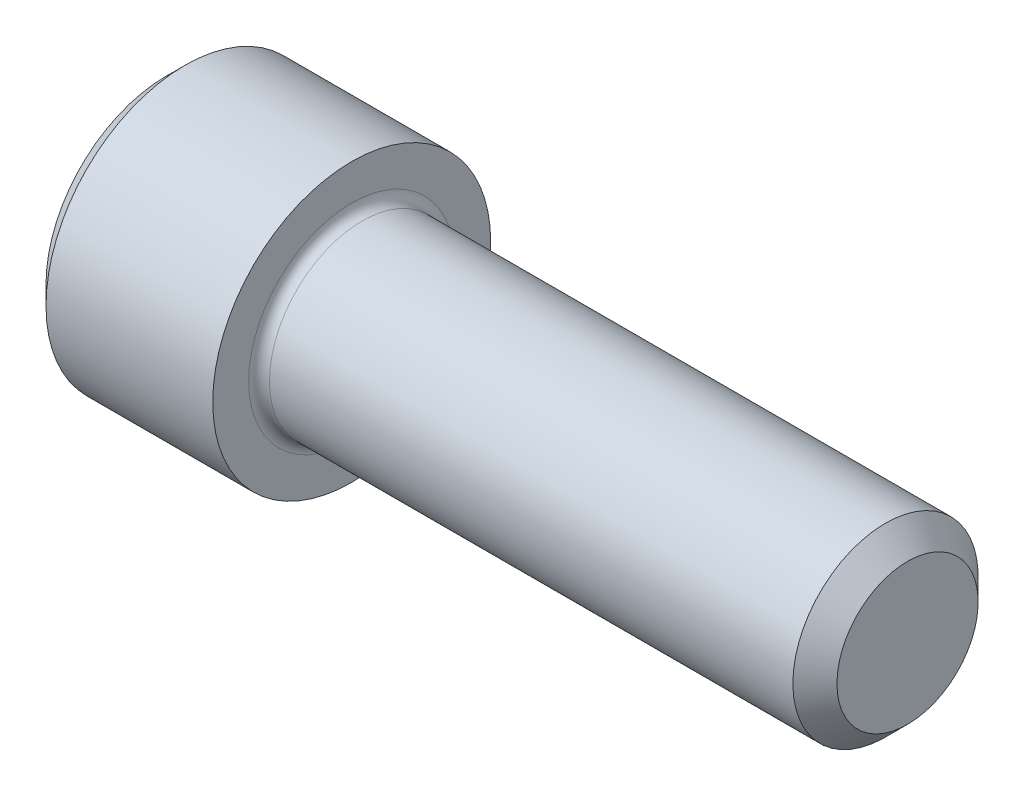
ISO-10303-21;
HEADER;
FILE_DESCRIPTION(('STEP AP214'),'2;1');
FILE_NAME('part.step','',(''),(''),'','','');
FILE_SCHEMA(('AUTOMOTIVE_DESIGN { 1 0 10303 214 1 1 1 1 }'));
ENDSEC;
DATA;
#1=APPLICATION_CONTEXT('core data for automotive mechanical design processes');
#2=APPLICATION_PROTOCOL_DEFINITION('international standard','automotive_design',2000,#1);
#3=PRODUCT_CONTEXT('',#1,'mechanical');
#4=PRODUCT('Part','Part','',(#3));
#5=PRODUCT_RELATED_PRODUCT_CATEGORY('part','',(#4));
#6=PRODUCT_DEFINITION_FORMATION('','',#4);
#7=PRODUCT_DEFINITION_CONTEXT('part definition',#1,'design');
#8=PRODUCT_DEFINITION('design','',#6,#7);
#9=PRODUCT_DEFINITION_SHAPE('','',#8);
#10=(LENGTH_UNIT() NAMED_UNIT(*) SI_UNIT(.MILLI.,.METRE.));
#11=(NAMED_UNIT(*) PLANE_ANGLE_UNIT() SI_UNIT($,.RADIAN.));
#12=(NAMED_UNIT(*) SI_UNIT($,.STERADIAN.) SOLID_ANGLE_UNIT());
#13=UNCERTAINTY_MEASURE_WITH_UNIT(LENGTH_MEASURE(1.E-05),#10,'distance_accuracy_value','');
#14=(GEOMETRIC_REPRESENTATION_CONTEXT(3) GLOBAL_UNCERTAINTY_ASSIGNED_CONTEXT((#13)) GLOBAL_UNIT_ASSIGNED_CONTEXT((#10,
#11,#12)) REPRESENTATION_CONTEXT('',''));
#15=CARTESIAN_POINT('',(0.,0.,0.));
#16=DIRECTION('',(0.,0.,1.));
#17=DIRECTION('',(1.,0.,0.));
#18=AXIS2_PLACEMENT_3D('',#15,#16,#17);
#19=CARTESIAN_POINT('',(0.,0.,0.));
#20=DIRECTION('',(-1.,0.,0.));
#21=DIRECTION('',(0.,0.,1.));
#22=AXIS2_PLACEMENT_3D('',#19,#20,#21);
#23=PLANE('',#22);
#24=DIRECTION('',(0.,-0.499999999999998,0.86602540378444));
#25=VECTOR('',#24,1.);
#26=CARTESIAN_POINT('',(0.,2.7496306570156,0.));
#27=LINE('',#26,#25);
#28=CARTESIAN_POINT('',(0.,2.7496306570156,0.));
#29=VERTEX_POINT('',#28);
#30=CARTESIAN_POINT('',(0.,1.37481532850781,2.38124999999995));
#31=VERTEX_POINT('',#30);
#32=EDGE_CURVE('E264',#29,#31,#27,.T.);
#33=ORIENTED_EDGE('',*,*,#32,.T.);
#34=DIRECTION('',(0.,1.,0.));
#35=VECTOR('',#34,1.);
#36=CARTESIAN_POINT('',(0.,-1.37481532850779,2.38124999999999));
#37=LINE('',#36,#35);
#38=CARTESIAN_POINT('',(0.,-1.37481532850779,2.38124999999999));
#39=VERTEX_POINT('',#38);
#40=EDGE_CURVE('E124',#39,#31,#37,.T.);
#41=ORIENTED_EDGE('',*,*,#40,.F.);
#42=DIRECTION('',(0.,-0.500000000000001,-0.866025403784439));
#43=VECTOR('',#42,1.);
#44=CARTESIAN_POINT('',(0.,-1.37481532850779,2.38124999999999));
#45=LINE('',#44,#43);
#46=CARTESIAN_POINT('',(0.,-2.7496306570156,0.));
#47=VERTEX_POINT('',#46);
#48=EDGE_CURVE('E267',#39,#47,#45,.T.);
#49=ORIENTED_EDGE('',*,*,#48,.T.);
#50=DIRECTION('',(0.,0.499999999999998,-0.86602540378444));
#51=VECTOR('',#50,1.);
#52=CARTESIAN_POINT('',(0.,-2.7496306570156,0.));
#53=LINE('',#52,#51);
#54=CARTESIAN_POINT('',(0.,-1.37481532850779,-2.38125000000002));
#55=VERTEX_POINT('',#54);
#56=EDGE_CURVE('E270',#47,#55,#53,.T.);
#57=ORIENTED_EDGE('',*,*,#56,.T.);
#58=DIRECTION('',(0.,-1.,0.));
#59=VECTOR('',#58,1.);
#60=CARTESIAN_POINT('',(0.,1.37481532850781,-2.38125000000004));
#61=LINE('',#60,#59);
#62=CARTESIAN_POINT('',(0.,1.37481532850781,-2.38125000000004));
#63=VERTEX_POINT('',#62);
#64=EDGE_CURVE('E273',#63,#55,#61,.T.);
#65=ORIENTED_EDGE('',*,*,#64,.F.);
#66=DIRECTION('',(0.,-0.500000000000001,-0.866025403784439));
#67=VECTOR('',#66,1.);
#68=CARTESIAN_POINT('',(0.,2.7496306570156,0.));
#69=LINE('',#68,#67);
#70=EDGE_CURVE('E119',#29,#63,#69,.T.);
#71=ORIENTED_EDGE('',*,*,#70,.F.);
#72=EDGE_LOOP('',(#33,#41,#49,#57,#65,#71));
#73=FACE_BOUND('',#72,.T.);
#74=CARTESIAN_POINT('',(0.,0.,0.));
#75=DIRECTION('',(-1.,0.,0.));
#76=DIRECTION('',(0.,0.,1.));
#77=AXIS2_PLACEMENT_3D('',#74,#75,#76);
#78=CIRCLE('',#77,4.1275);
#79=CARTESIAN_POINT('',(0.,0.,4.12750000000003));
#80=VERTEX_POINT('',#79);
#81=EDGE_CURVE('E148',#80,#80,#78,.T.);
#82=ORIENTED_EDGE('',*,*,#81,.T.);
#83=EDGE_LOOP('',(#82));
#84=FACE_BOUND('',#83,.T.);
#85=ADVANCED_FACE('F32',(#73,#84),#23,.T.);
#86=CARTESIAN_POINT('',(0.,0.,0.));
#87=DIRECTION('',(1.,0.,0.));
#88=DIRECTION('',(0.,0.,-1.));
#89=AXIS2_PLACEMENT_3D('',#86,#87,#88);
#90=CONICAL_SURFACE('',#89,4.1275,0.785398163397448);
#91=CARTESIAN_POINT('',(0.635000000000004,0.,0.));
#92=DIRECTION('',(-1.,0.,0.));
#93=DIRECTION('',(0.,0.,1.));
#94=AXIS2_PLACEMENT_3D('',#91,#92,#93);
#95=CIRCLE('',#94,4.7625);
#96=CARTESIAN_POINT('',(0.635000000000004,0.,4.76250000000001));
#97=VERTEX_POINT('',#96);
#98=EDGE_CURVE('E145',#97,#97,#95,.T.);
#99=ORIENTED_EDGE('',*,*,#98,.T.);
#100=EDGE_LOOP('',(#99));
#101=FACE_BOUND('',#100,.T.);
#102=ORIENTED_EDGE('',*,*,#81,.F.);
#103=EDGE_LOOP('',(#102));
#104=FACE_BOUND('',#103,.T.);
#105=ADVANCED_FACE('F169',(#101,#104),#90,.T.);
#106=CARTESIAN_POINT('',(-31.75,0.,0.));
#107=DIRECTION('',(-1.,0.,0.));
#108=DIRECTION('',(0.,0.,1.));
#109=AXIS2_PLACEMENT_3D('',#106,#107,#108);
#110=CYLINDRICAL_SURFACE('',#109,4.7625);
#111=CARTESIAN_POINT('',(6.34999999999997,0.,0.));
#112=DIRECTION('',(-1.,0.,0.));
#113=DIRECTION('',(0.,0.,1.));
#114=AXIS2_PLACEMENT_3D('',#111,#112,#113);
#115=CIRCLE('',#114,4.7625);
#116=CARTESIAN_POINT('',(6.34999999999997,0.,4.76250000000005));
#117=VERTEX_POINT('',#116);
#118=EDGE_CURVE('E142',#117,#117,#115,.T.);
#119=ORIENTED_EDGE('',*,*,#118,.T.);
#120=EDGE_LOOP('',(#119));
#121=FACE_BOUND('',#120,.T.);
#122=ORIENTED_EDGE('',*,*,#98,.F.);
#123=EDGE_LOOP('',(#122));
#124=FACE_BOUND('',#123,.T.);
#125=ADVANCED_FACE('F174',(#121,#124),#110,.T.);
#126=CARTESIAN_POINT('',(6.34999999999996,4.76250000000001,0.));
#127=DIRECTION('',(1.,0.,0.));
#128=DIRECTION('',(0.,0.,-1.));
#129=AXIS2_PLACEMENT_3D('',#126,#127,#128);
#130=PLANE('',#129);
#131=CARTESIAN_POINT('',(6.34999999999997,0.,0.));
#132=DIRECTION('',(1.,0.,0.));
#133=DIRECTION('',(0.,0.,-1.));
#134=AXIS2_PLACEMENT_3D('',#131,#132,#133);
#135=CIRCLE('',#134,3.5306);
#136=CARTESIAN_POINT('',(6.34999999999997,0.,-3.53059999999996));
#137=VERTEX_POINT('',#136);
#138=EDGE_CURVE('E40',#137,#137,#135,.F.);
#139=ORIENTED_EDGE('',*,*,#138,.T.);
#140=EDGE_LOOP('',(#139));
#141=FACE_BOUND('',#140,.T.);
#142=ORIENTED_EDGE('',*,*,#118,.F.);
#143=EDGE_LOOP('',(#142));
#144=FACE_BOUND('',#143,.T.);
#145=ADVANCED_FACE('F153',(#141,#144),#130,.T.);
#146=CARTESIAN_POINT('',(-31.75,0.,0.));
#147=DIRECTION('',(-1.,0.,0.));
#148=DIRECTION('',(0.,0.,1.));
#149=AXIS2_PLACEMENT_3D('',#146,#147,#148);
#150=CYLINDRICAL_SURFACE('',#149,3.175);
#151=CARTESIAN_POINT('',(6.70559999999997,0.,0.));
#152=DIRECTION('',(1.,0.,0.));
#153=DIRECTION('',(0.,0.,-1.));
#154=AXIS2_PLACEMENT_3D('',#151,#152,#153);
#155=CIRCLE('',#154,3.175);
#156=CARTESIAN_POINT('',(6.70559999999997,0.,-3.17499999999996));
#157=VERTEX_POINT('',#156);
#158=EDGE_CURVE('E11',#157,#157,#155,.T.);
#159=ORIENTED_EDGE('',*,*,#158,.T.);
#160=EDGE_LOOP('',(#159));
#161=FACE_BOUND('',#160,.T.);
#162=CARTESIAN_POINT('',(24.64435,0.,0.));
#163=DIRECTION('',(-1.,0.,0.));
#164=DIRECTION('',(0.,0.,1.));
#165=AXIS2_PLACEMENT_3D('',#162,#163,#164);
#166=CIRCLE('',#165,3.175);
#167=CARTESIAN_POINT('',(24.64435,0.,3.17499999999998));
#168=VERTEX_POINT('',#167);
#169=EDGE_CURVE('E139',#168,#168,#166,.T.);
#170=ORIENTED_EDGE('',*,*,#169,.T.);
#171=EDGE_LOOP('',(#170));
#172=FACE_BOUND('',#171,.T.);
#173=ADVANCED_FACE('F184',(#161,#172),#150,.T.);
#174=CARTESIAN_POINT('',(25.4,0.,0.));
#175=DIRECTION('',(-1.,0.,0.));
#176=DIRECTION('',(0.,0.,1.));
#177=AXIS2_PLACEMENT_3D('',#174,#175,#176);
#178=CONICAL_SURFACE('',#177,2.41935,0.785398163397455);
#179=ORIENTED_EDGE('',*,*,#169,.F.);
#180=EDGE_LOOP('',(#179));
#181=FACE_BOUND('',#180,.T.);
#182=CARTESIAN_POINT('',(25.4,0.,0.));
#183=DIRECTION('',(-1.,0.,0.));
#184=DIRECTION('',(0.,0.,1.));
#185=AXIS2_PLACEMENT_3D('',#182,#183,#184);
#186=CIRCLE('',#185,2.41935);
#187=CARTESIAN_POINT('',(25.4,0.,2.41935000000002));
#188=VERTEX_POINT('',#187);
#189=EDGE_CURVE('E135',#188,#188,#186,.T.);
#190=ORIENTED_EDGE('',*,*,#189,.T.);
#191=EDGE_LOOP('',(#190));
#192=FACE_BOUND('',#191,.T.);
#193=ADVANCED_FACE('F164',(#181,#192),#178,.T.);
#194=CARTESIAN_POINT('',(25.4,2.41935,0.));
#195=DIRECTION('',(1.,0.,0.));
#196=DIRECTION('',(0.,0.,-1.));
#197=AXIS2_PLACEMENT_3D('',#194,#195,#196);
#198=PLANE('',#197);
#199=ORIENTED_EDGE('',*,*,#189,.F.);
#200=EDGE_LOOP('',(#199));
#201=FACE_BOUND('',#200,.T.);
#202=ADVANCED_FACE('F157',(#201),#198,.T.);
#203=CARTESIAN_POINT('',(6.70559999999997,0.,0.));
#204=DIRECTION('',(1.,0.,0.));
#205=DIRECTION('',(0.,0.,-1.));
#206=AXIS2_PLACEMENT_3D('',#203,#204,#205);
#207=TOROIDAL_SURFACE('',#206,3.5306,0.3556);
#208=ORIENTED_EDGE('',*,*,#158,.F.);
#209=EDGE_LOOP('',(#208));
#210=FACE_BOUND('',#209,.T.);
#211=ORIENTED_EDGE('',*,*,#138,.F.);
#212=EDGE_LOOP('',(#211));
#213=FACE_BOUND('',#212,.T.);
#214=ADVANCED_FACE('F34',(#210,#213),#207,.F.);
#215=CARTESIAN_POINT('',(3.048,2.7496306570156,0.));
#216=DIRECTION('',(0.,-0.86602540378444,-0.499999999999998));
#217=DIRECTION('',(0.,0.499999999999998,-0.866025403784441));
#218=AXIS2_PLACEMENT_3D('',#215,#216,#217);
#219=PLANE('',#218);
#220=ORIENTED_EDGE('',*,*,#32,.F.);
#221=DIRECTION('',(-1.,0.,0.));
#222=VECTOR('',#221,1.);
#223=CARTESIAN_POINT('',(3.048,2.7496306570156,0.));
#224=LINE('',#223,#222);
#225=CARTESIAN_POINT('',(3.048,2.7496306570156,0.));
#226=VERTEX_POINT('',#225);
#227=EDGE_CURVE('E263',#226,#29,#224,.T.);
#228=ORIENTED_EDGE('',*,*,#227,.F.);
#229=DIRECTION('',(0.,-0.499999999999998,0.86602540378444));
#230=VECTOR('',#229,1.);
#231=CARTESIAN_POINT('',(3.048,2.7496306570156,0.));
#232=LINE('',#231,#230);
#233=CARTESIAN_POINT('',(3.048,2.06222299276169,1.19062499999997));
#234=VERTEX_POINT('',#233);
#235=EDGE_CURVE('E47',#226,#234,#232,.T.);
#236=ORIENTED_EDGE('',*,*,#235,.T.);
#237=CARTESIAN_POINT('',(3.04799999999999,1.37481532850781,2.38124999999997));
#238=VERTEX_POINT('',#237);
#239=EDGE_CURVE('E105',#234,#238,#232,.T.);
#240=ORIENTED_EDGE('',*,*,#239,.T.);
#241=DIRECTION('',(-1.,0.,0.));
#242=VECTOR('',#241,1.);
#243=CARTESIAN_POINT('',(3.04799999999999,1.37481532850781,2.38124999999997));
#244=LINE('',#243,#242);
#245=EDGE_CURVE('E117',#238,#31,#244,.T.);
#246=ORIENTED_EDGE('',*,*,#245,.T.);
#247=EDGE_LOOP('',(#220,#228,#236,#240,#246));
#248=FACE_BOUND('',#247,.T.);
#249=ADVANCED_FACE('F116',(#248),#219,.T.);
#250=CARTESIAN_POINT('',(3.04799999999999,-1.37481532850779,2.38124999999999));
#251=DIRECTION('',(0.,0.,1.));
#252=DIRECTION('',(0.,-1.,0.));
#253=AXIS2_PLACEMENT_3D('',#250,#251,#252);
#254=PLANE('',#253);
#255=ORIENTED_EDGE('',*,*,#40,.T.);
#256=ORIENTED_EDGE('',*,*,#245,.F.);
#257=DIRECTION('',(0.,1.,0.));
#258=VECTOR('',#257,1.);
#259=CARTESIAN_POINT('',(3.04799999999999,-1.37481532850779,2.38124999999999));
#260=LINE('',#259,#258);
#261=CARTESIAN_POINT('',(3.04799999999999,0.,2.38125000000002));
#262=VERTEX_POINT('',#261);
#263=EDGE_CURVE('E103',#262,#238,#260,.T.);
#264=ORIENTED_EDGE('',*,*,#263,.F.);
#265=CARTESIAN_POINT('',(3.04799999999999,-1.37481532850779,2.38124999999999));
#266=VERTEX_POINT('',#265);
#267=EDGE_CURVE('E113',#266,#262,#260,.T.);
#268=ORIENTED_EDGE('',*,*,#267,.F.);
#269=DIRECTION('',(-1.,0.,0.));
#270=VECTOR('',#269,1.);
#271=CARTESIAN_POINT('',(3.04799999999999,-1.37481532850779,2.38124999999999));
#272=LINE('',#271,#270);
#273=EDGE_CURVE('E126',#266,#39,#272,.T.);
#274=ORIENTED_EDGE('',*,*,#273,.T.);
#275=EDGE_LOOP('',(#255,#256,#264,#268,#274));
#276=FACE_BOUND('',#275,.T.);
#277=ADVANCED_FACE('F121',(#276),#254,.F.);
#278=CARTESIAN_POINT('',(3.04799999999999,-1.37481532850779,2.38124999999999));
#279=DIRECTION('',(0.,0.866025403784439,-0.500000000000001));
#280=DIRECTION('',(0.,0.500000000000001,0.866025403784439));
#281=AXIS2_PLACEMENT_3D('',#278,#279,#280);
#282=PLANE('',#281);
#283=ORIENTED_EDGE('',*,*,#48,.F.);
#284=ORIENTED_EDGE('',*,*,#273,.F.);
#285=DIRECTION('',(0.,-0.500000000000001,-0.866025403784439));
#286=VECTOR('',#285,1.);
#287=CARTESIAN_POINT('',(3.04799999999999,-1.37481532850779,2.38124999999999));
#288=LINE('',#287,#286);
#289=CARTESIAN_POINT('',(3.048,-2.06222299276171,1.19062499999999));
#290=VERTEX_POINT('',#289);
#291=EDGE_CURVE('E244',#266,#290,#288,.T.);
#292=ORIENTED_EDGE('',*,*,#291,.T.);
#293=CARTESIAN_POINT('',(3.048,-2.7496306570156,0.));
#294=VERTEX_POINT('',#293);
#295=EDGE_CURVE('E246',#290,#294,#288,.T.);
#296=ORIENTED_EDGE('',*,*,#295,.T.);
#297=DIRECTION('',(-1.,0.,0.));
#298=VECTOR('',#297,1.);
#299=CARTESIAN_POINT('',(3.048,-2.7496306570156,0.));
#300=LINE('',#299,#298);
#301=EDGE_CURVE('E131',#294,#47,#300,.T.);
#302=ORIENTED_EDGE('',*,*,#301,.T.);
#303=EDGE_LOOP('',(#283,#284,#292,#296,#302));
#304=FACE_BOUND('',#303,.T.);
#305=ADVANCED_FACE('F196',(#304),#282,.T.);
#306=CARTESIAN_POINT('',(3.048,-2.7496306570156,0.));
#307=DIRECTION('',(0.,0.86602540378444,0.499999999999998));
#308=DIRECTION('',(0.,-0.499999999999998,0.86602540378444));
#309=AXIS2_PLACEMENT_3D('',#306,#307,#308);
#310=PLANE('',#309);
#311=ORIENTED_EDGE('',*,*,#56,.F.);
#312=ORIENTED_EDGE('',*,*,#301,.F.);
#313=DIRECTION('',(0.,0.499999999999998,-0.86602540378444));
#314=VECTOR('',#313,1.);
#315=CARTESIAN_POINT('',(3.048,-2.7496306570156,0.));
#316=LINE('',#315,#314);
#317=CARTESIAN_POINT('',(3.04799999999995,-2.06222299276171,-1.19062500000003));
#318=VERTEX_POINT('',#317);
#319=EDGE_CURVE('E249',#294,#318,#316,.T.);
#320=ORIENTED_EDGE('',*,*,#319,.T.);
#321=CARTESIAN_POINT('',(3.04799999999995,-1.37481532850781,-2.38125000000003));
#322=VERTEX_POINT('',#321);
#323=EDGE_CURVE('E253',#318,#322,#316,.T.);
#324=ORIENTED_EDGE('',*,*,#323,.T.);
#325=DIRECTION('',(-1.,0.,0.));
#326=VECTOR('',#325,1.);
#327=CARTESIAN_POINT('',(3.04799999999995,-1.37481532850781,-2.38125000000003));
#328=LINE('',#327,#326);
#329=EDGE_CURVE('E282',#322,#55,#328,.T.);
#330=ORIENTED_EDGE('',*,*,#329,.T.);
#331=EDGE_LOOP('',(#311,#312,#320,#324,#330));
#332=FACE_BOUND('',#331,.T.);
#333=ADVANCED_FACE('F199',(#332),#310,.T.);
#334=CARTESIAN_POINT('',(3.04799999999996,1.37481532850781,-2.38125000000003));
#335=DIRECTION('',(0.,0.,-1.));
#336=DIRECTION('',(0.,1.,0.));
#337=AXIS2_PLACEMENT_3D('',#334,#335,#336);
#338=PLANE('',#337);
#339=ORIENTED_EDGE('',*,*,#64,.T.);
#340=ORIENTED_EDGE('',*,*,#329,.F.);
#341=DIRECTION('',(0.,-1.,0.));
#342=VECTOR('',#341,1.);
#343=CARTESIAN_POINT('',(3.04799999999996,1.37481532850781,-2.38125000000003));
#344=LINE('',#343,#342);
#345=CARTESIAN_POINT('',(3.04799999999996,0.,-2.38124999999999));
#346=VERTEX_POINT('',#345);
#347=EDGE_CURVE('E257',#346,#322,#344,.T.);
#348=ORIENTED_EDGE('',*,*,#347,.F.);
#349=CARTESIAN_POINT('',(3.04799999999996,1.37481532850781,-2.38125000000003));
#350=VERTEX_POINT('',#349);
#351=EDGE_CURVE('E258',#350,#346,#344,.T.);
#352=ORIENTED_EDGE('',*,*,#351,.F.);
#353=DIRECTION('',(-1.,0.,0.));
#354=VECTOR('',#353,1.);
#355=CARTESIAN_POINT('',(3.04799999999996,1.37481532850781,-2.38125000000003));
#356=LINE('',#355,#354);
#357=EDGE_CURVE('E279',#350,#63,#356,.T.);
#358=ORIENTED_EDGE('',*,*,#357,.T.);
#359=EDGE_LOOP('',(#339,#340,#348,#352,#358));
#360=FACE_BOUND('',#359,.T.);
#361=ADVANCED_FACE('F203',(#360),#338,.F.);
#362=CARTESIAN_POINT('',(3.048,2.7496306570156,0.));
#363=DIRECTION('',(0.,0.866025403784439,-0.500000000000001));
#364=DIRECTION('',(0.,0.500000000000001,0.866025403784439));
#365=AXIS2_PLACEMENT_3D('',#362,#363,#364);
#366=PLANE('',#365);
#367=ORIENTED_EDGE('',*,*,#70,.T.);
#368=ORIENTED_EDGE('',*,*,#357,.F.);
#369=DIRECTION('',(0.,-0.500000000000001,-0.866025403784439));
#370=VECTOR('',#369,1.);
#371=CARTESIAN_POINT('',(3.048,2.7496306570156,0.));
#372=LINE('',#371,#370);
#373=CARTESIAN_POINT('',(3.04799999999996,2.06222299276168,-1.19062500000003));
#374=VERTEX_POINT('',#373);
#375=EDGE_CURVE('E261',#374,#350,#372,.T.);
#376=ORIENTED_EDGE('',*,*,#375,.F.);
#377=EDGE_CURVE('E235',#226,#374,#372,.T.);
#378=ORIENTED_EDGE('',*,*,#377,.F.);
#379=ORIENTED_EDGE('',*,*,#227,.T.);
#380=EDGE_LOOP('',(#367,#368,#376,#378,#379));
#381=FACE_BOUND('',#380,.T.);
#382=ADVANCED_FACE('F207',(#381),#366,.F.);
#383=CARTESIAN_POINT('',(3.04799999999999,1.37481532850781,2.38124999999997));
#384=DIRECTION('',(-1.,0.,0.));
#385=DIRECTION('',(0.,0.,1.));
#386=AXIS2_PLACEMENT_3D('',#383,#384,#385);
#387=PLANE('',#386);
#388=CARTESIAN_POINT('',(3.048,0.,0.));
#389=DIRECTION('',(-1.,0.,0.));
#390=DIRECTION('',(0.,0.,1.));
#391=AXIS2_PLACEMENT_3D('',#388,#389,#390);
#392=CIRCLE('',#391,2.38125);
#393=EDGE_CURVE('E125',#290,#262,#392,.T.);
#394=ORIENTED_EDGE('',*,*,#393,.F.);
#395=ORIENTED_EDGE('',*,*,#291,.F.);
#396=ORIENTED_EDGE('',*,*,#267,.T.);
#397=EDGE_LOOP('',(#394,#395,#396));
#398=FACE_BOUND('',#397,.T.);
#399=ADVANCED_FACE('F211',(#398),#387,.T.);
#400=EDGE_CURVE('E129',#318,#290,#392,.T.);
#401=ORIENTED_EDGE('',*,*,#400,.F.);
#402=ORIENTED_EDGE('',*,*,#319,.F.);
#403=ORIENTED_EDGE('',*,*,#295,.F.);
#404=EDGE_LOOP('',(#401,#402,#403));
#405=FACE_BOUND('',#404,.T.);
#406=ADVANCED_FACE('F214',(#405),#387,.T.);
#407=EDGE_CURVE('E288',#346,#318,#392,.T.);
#408=ORIENTED_EDGE('',*,*,#407,.F.);
#409=ORIENTED_EDGE('',*,*,#347,.T.);
#410=ORIENTED_EDGE('',*,*,#323,.F.);
#411=EDGE_LOOP('',(#408,#409,#410));
#412=FACE_BOUND('',#411,.T.);
#413=ADVANCED_FACE('F219',(#412),#387,.T.);
#414=EDGE_CURVE('E238',#374,#346,#392,.T.);
#415=ORIENTED_EDGE('',*,*,#414,.F.);
#416=ORIENTED_EDGE('',*,*,#375,.T.);
#417=ORIENTED_EDGE('',*,*,#351,.T.);
#418=EDGE_LOOP('',(#415,#416,#417));
#419=FACE_BOUND('',#418,.T.);
#420=ADVANCED_FACE('F226',(#419),#387,.T.);
#421=EDGE_CURVE('E136',#234,#374,#392,.T.);
#422=ORIENTED_EDGE('',*,*,#421,.F.);
#423=ORIENTED_EDGE('',*,*,#235,.F.);
#424=ORIENTED_EDGE('',*,*,#377,.T.);
#425=EDGE_LOOP('',(#422,#423,#424));
#426=FACE_BOUND('',#425,.T.);
#427=ADVANCED_FACE('F222',(#426),#387,.T.);
#428=EDGE_CURVE('E108',#262,#234,#392,.T.);
#429=ORIENTED_EDGE('',*,*,#428,.F.);
#430=ORIENTED_EDGE('',*,*,#263,.T.);
#431=ORIENTED_EDGE('',*,*,#239,.F.);
#432=EDGE_LOOP('',(#429,#430,#431));
#433=FACE_BOUND('',#432,.T.);
#434=ADVANCED_FACE('F104',(#433),#387,.T.);
#435=CARTESIAN_POINT('',(3.048,0.,0.));
#436=DIRECTION('',(-1.,0.,0.));
#437=DIRECTION('',(0.,0.,1.));
#438=AXIS2_PLACEMENT_3D('',#435,#436,#437);
#439=CONICAL_SURFACE('',#438,2.38125,1.04719755119659);
#440=CARTESIAN_POINT('',(4.42281532850781,0.,0.));
#441=VERTEX_POINT('',#440);
#442=VERTEX_LOOP('',#441);
#443=FACE_BOUND('',#442,.T.);
#444=ORIENTED_EDGE('',*,*,#428,.T.);
#445=ORIENTED_EDGE('',*,*,#421,.T.);
#446=ORIENTED_EDGE('',*,*,#414,.T.);
#447=ORIENTED_EDGE('',*,*,#407,.T.);
#448=ORIENTED_EDGE('',*,*,#400,.T.);
#449=ORIENTED_EDGE('',*,*,#393,.T.);
#450=EDGE_LOOP('',(#444,#445,#446,#447,#448,#449));
#451=FACE_BOUND('',#450,.T.);
#452=ADVANCED_FACE('F191',(#443,#451),#439,.F.);
#453=CLOSED_SHELL('',(#85,#105,#125,#145,#173,#193,#202,#214,#249,#277,#305,#333,#361,#382,#399,
#406,#413,#420,#427,#434,#452));
#454=MANIFOLD_SOLID_BREP('B2',#453);
#455=ADVANCED_BREP_SHAPE_REPRESENTATION('',(#18,#454),#14);
#456=SHAPE_DEFINITION_REPRESENTATION(#9,#455);
ENDSEC;
END-ISO-10303-21;
